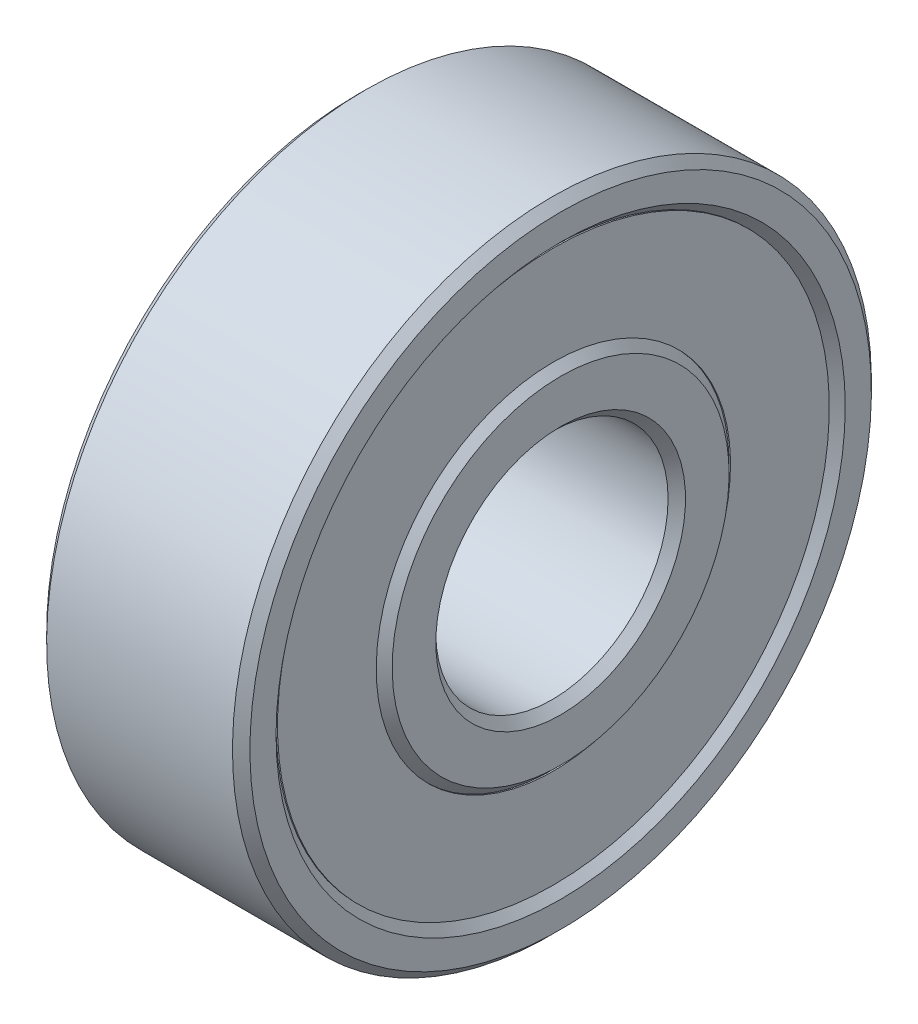
ISO-10303-21;
HEADER;
FILE_DESCRIPTION(('STEP AP214'),'2;1');
FILE_NAME('part.step','',(''),(''),'','','');
FILE_SCHEMA(('AUTOMOTIVE_DESIGN { 1 0 10303 214 1 1 1 1 }'));
ENDSEC;
DATA;
#1=APPLICATION_CONTEXT('core data for automotive mechanical design processes');
#2=APPLICATION_PROTOCOL_DEFINITION('international standard','automotive_design',2000,#1);
#3=PRODUCT_CONTEXT('',#1,'mechanical');
#4=PRODUCT('Part','Part','',(#3));
#5=PRODUCT_RELATED_PRODUCT_CATEGORY('part','',(#4));
#6=PRODUCT_DEFINITION_FORMATION('','',#4);
#7=PRODUCT_DEFINITION_CONTEXT('part definition',#1,'design');
#8=PRODUCT_DEFINITION('design','',#6,#7);
#9=PRODUCT_DEFINITION_SHAPE('','',#8);
#10=(LENGTH_UNIT() NAMED_UNIT(*) SI_UNIT(.MILLI.,.METRE.));
#11=(NAMED_UNIT(*) PLANE_ANGLE_UNIT() SI_UNIT($,.RADIAN.));
#12=(NAMED_UNIT(*) SI_UNIT($,.STERADIAN.) SOLID_ANGLE_UNIT());
#13=UNCERTAINTY_MEASURE_WITH_UNIT(LENGTH_MEASURE(1.E-05),#10,'distance_accuracy_value','');
#14=(GEOMETRIC_REPRESENTATION_CONTEXT(3) GLOBAL_UNCERTAINTY_ASSIGNED_CONTEXT((#13)) GLOBAL_UNIT_ASSIGNED_CONTEXT((#10,
#11,#12)) REPRESENTATION_CONTEXT('',''));
#15=CARTESIAN_POINT('',(0.,0.,0.));
#16=DIRECTION('',(0.,0.,1.));
#17=DIRECTION('',(1.,0.,0.));
#18=AXIS2_PLACEMENT_3D('',#15,#16,#17);
#19=CARTESIAN_POINT('',(0.25,0.,0.));
#20=DIRECTION('',(-1.,0.,0.));
#21=DIRECTION('',(0.,1.,0.));
#22=AXIS2_PLACEMENT_3D('',#19,#20,#21);
#23=CYLINDRICAL_SURFACE('',#22,6.1);
#24=CARTESIAN_POINT('',(6.75,0.,0.));
#25=DIRECTION('',(1.,0.,0.));
#26=DIRECTION('',(0.,1.,0.));
#27=AXIS2_PLACEMENT_3D('',#24,#25,#26);
#28=CIRCLE('',#27,6.1);
#29=CARTESIAN_POINT('',(6.75,6.10000000000005,0.));
#30=VERTEX_POINT('',#29);
#31=EDGE_CURVE('E10',#30,#30,#28,.T.);
#32=ORIENTED_EDGE('',*,*,#31,.T.);
#33=EDGE_LOOP('',(#32));
#34=FACE_BOUND('',#33,.T.);
#35=CARTESIAN_POINT('',(6.7,0.,0.));
#36=DIRECTION('',(1.,0.,0.));
#37=DIRECTION('',(0.,1.,0.));
#38=AXIS2_PLACEMENT_3D('',#35,#36,#37);
#39=CIRCLE('',#38,6.1);
#40=CARTESIAN_POINT('',(6.7,6.1,0.));
#41=VERTEX_POINT('',#40);
#42=EDGE_CURVE('E23',#41,#41,#39,.T.);
#43=ORIENTED_EDGE('',*,*,#42,.F.);
#44=EDGE_LOOP('',(#43));
#45=FACE_BOUND('',#44,.T.);
#46=ADVANCED_FACE('F15',(#34,#45),#23,.F.);
#47=CARTESIAN_POINT('',(6.75,0.,0.));
#48=DIRECTION('',(1.,0.,0.));
#49=DIRECTION('',(0.,1.,0.));
#50=AXIS2_PLACEMENT_3D('',#47,#48,#49);
#51=PLANE('',#50);
#52=ORIENTED_EDGE('',*,*,#31,.F.);
#53=EDGE_LOOP('',(#52));
#54=FACE_BOUND('',#53,.T.);
#55=CARTESIAN_POINT('',(6.75,0.,0.));
#56=DIRECTION('',(1.,0.,0.));
#57=DIRECTION('',(0.,1.,0.));
#58=AXIS2_PLACEMENT_3D('',#55,#56,#57);
#59=CIRCLE('',#58,9.5);
#60=CARTESIAN_POINT('',(6.75,9.5,0.));
#61=VERTEX_POINT('',#60);
#62=EDGE_CURVE('E33',#61,#61,#59,.T.);
#63=ORIENTED_EDGE('',*,*,#62,.T.);
#64=EDGE_LOOP('',(#63));
#65=FACE_BOUND('',#64,.T.);
#66=ADVANCED_FACE('F17',(#54,#65),#51,.T.);
#67=CARTESIAN_POINT('',(6.7,0.,0.));
#68=DIRECTION('',(-1.,0.,0.));
#69=DIRECTION('',(0.,1.,0.));
#70=AXIS2_PLACEMENT_3D('',#67,#68,#69);
#71=CONICAL_SURFACE('',#70,6.1,0.785398163397);
#72=CARTESIAN_POINT('',(7.,0.,0.));
#73=DIRECTION('',(1.,0.,0.));
#74=DIRECTION('',(0.,1.,0.));
#75=AXIS2_PLACEMENT_3D('',#72,#73,#74);
#76=CIRCLE('',#75,5.8);
#77=CARTESIAN_POINT('',(7.,5.8,0.));
#78=VERTEX_POINT('',#77);
#79=EDGE_CURVE('E40',#78,#78,#76,.T.);
#80=ORIENTED_EDGE('',*,*,#79,.F.);
#81=EDGE_LOOP('',(#80));
#82=FACE_BOUND('',#81,.T.);
#83=ORIENTED_EDGE('',*,*,#42,.T.);
#84=EDGE_LOOP('',(#83));
#85=FACE_BOUND('',#84,.T.);
#86=ADVANCED_FACE('F133',(#82,#85),#71,.T.);
#87=CARTESIAN_POINT('',(0.25,0.,0.));
#88=DIRECTION('',(-1.,0.,0.));
#89=DIRECTION('',(0.,1.,0.));
#90=AXIS2_PLACEMENT_3D('',#87,#88,#89);
#91=CYLINDRICAL_SURFACE('',#90,9.5);
#92=ORIENTED_EDGE('',*,*,#62,.F.);
#93=EDGE_LOOP('',(#92));
#94=FACE_BOUND('',#93,.T.);
#95=CARTESIAN_POINT('',(6.7,0.,0.));
#96=DIRECTION('',(1.,0.,0.));
#97=DIRECTION('',(0.,1.,0.));
#98=AXIS2_PLACEMENT_3D('',#95,#96,#97);
#99=CIRCLE('',#98,9.5);
#100=CARTESIAN_POINT('',(6.7,9.50000000000005,0.));
#101=VERTEX_POINT('',#100);
#102=EDGE_CURVE('E37',#101,#101,#99,.T.);
#103=ORIENTED_EDGE('',*,*,#102,.T.);
#104=EDGE_LOOP('',(#103));
#105=FACE_BOUND('',#104,.T.);
#106=ADVANCED_FACE('F180',(#94,#105),#91,.T.);
#107=CARTESIAN_POINT('',(7.,0.,0.));
#108=DIRECTION('',(1.,0.,0.));
#109=DIRECTION('',(0.,1.,0.));
#110=AXIS2_PLACEMENT_3D('',#107,#108,#109);
#111=PLANE('',#110);
#112=CARTESIAN_POINT('',(7.,0.,0.));
#113=DIRECTION('',(1.,0.,0.));
#114=DIRECTION('',(0.,1.,0.));
#115=AXIS2_PLACEMENT_3D('',#112,#113,#114);
#116=CIRCLE('',#115,4.3);
#117=CARTESIAN_POINT('',(7.,4.30000000000003,0.));
#118=VERTEX_POINT('',#117);
#119=EDGE_CURVE('E42',#118,#118,#116,.T.);
#120=ORIENTED_EDGE('',*,*,#119,.F.);
#121=EDGE_LOOP('',(#120));
#122=FACE_BOUND('',#121,.T.);
#123=ORIENTED_EDGE('',*,*,#79,.T.);
#124=EDGE_LOOP('',(#123));
#125=FACE_BOUND('',#124,.T.);
#126=ADVANCED_FACE('F154',(#122,#125),#111,.T.);
#127=CARTESIAN_POINT('',(6.7,0.,0.));
#128=DIRECTION('',(1.,0.,0.));
#129=DIRECTION('',(0.,1.,0.));
#130=AXIS2_PLACEMENT_3D('',#127,#128,#129);
#131=CONICAL_SURFACE('',#130,9.5,0.785398163397);
#132=CARTESIAN_POINT('',(7.,0.,0.));
#133=DIRECTION('',(1.,0.,0.));
#134=DIRECTION('',(0.,1.,0.));
#135=AXIS2_PLACEMENT_3D('',#132,#133,#134);
#136=CIRCLE('',#135,9.8);
#137=CARTESIAN_POINT('',(7.,9.80000000000005,0.));
#138=VERTEX_POINT('',#137);
#139=EDGE_CURVE('E48',#138,#138,#136,.T.);
#140=ORIENTED_EDGE('',*,*,#139,.T.);
#141=EDGE_LOOP('',(#140));
#142=FACE_BOUND('',#141,.T.);
#143=ORIENTED_EDGE('',*,*,#102,.F.);
#144=EDGE_LOOP('',(#143));
#145=FACE_BOUND('',#144,.T.);
#146=ADVANCED_FACE('F136',(#142,#145),#131,.F.);
#147=CARTESIAN_POINT('',(6.7,0.,0.));
#148=DIRECTION('',(1.,0.,0.));
#149=DIRECTION('',(0.,1.,0.));
#150=AXIS2_PLACEMENT_3D('',#147,#148,#149);
#151=CONICAL_SURFACE('',#150,4.,0.785398163397);
#152=ORIENTED_EDGE('',*,*,#119,.T.);
#153=EDGE_LOOP('',(#152));
#154=FACE_BOUND('',#153,.T.);
#155=CARTESIAN_POINT('',(6.7,0.,0.));
#156=DIRECTION('',(1.,0.,0.));
#157=DIRECTION('',(0.,1.,0.));
#158=AXIS2_PLACEMENT_3D('',#155,#156,#157);
#159=CIRCLE('',#158,4.);
#160=CARTESIAN_POINT('',(6.7,4.00000000000003,0.));
#161=VERTEX_POINT('',#160);
#162=EDGE_CURVE('E55',#161,#161,#159,.T.);
#163=ORIENTED_EDGE('',*,*,#162,.F.);
#164=EDGE_LOOP('',(#163));
#165=FACE_BOUND('',#164,.T.);
#166=ADVANCED_FACE('F145',(#154,#165),#151,.F.);
#167=CARTESIAN_POINT('',(7.,0.,0.));
#168=DIRECTION('',(1.,0.,0.));
#169=DIRECTION('',(0.,1.,0.));
#170=AXIS2_PLACEMENT_3D('',#167,#168,#169);
#171=PLANE('',#170);
#172=ORIENTED_EDGE('',*,*,#139,.F.);
#173=EDGE_LOOP('',(#172));
#174=FACE_BOUND('',#173,.T.);
#175=CARTESIAN_POINT('',(7.,0.,0.));
#176=DIRECTION('',(1.,0.,0.));
#177=DIRECTION('',(0.,1.,0.));
#178=AXIS2_PLACEMENT_3D('',#175,#176,#177);
#179=CIRCLE('',#178,10.7);
#180=CARTESIAN_POINT('',(7.,10.7,0.));
#181=VERTEX_POINT('',#180);
#182=EDGE_CURVE('E57',#181,#181,#179,.T.);
#183=ORIENTED_EDGE('',*,*,#182,.T.);
#184=EDGE_LOOP('',(#183));
#185=FACE_BOUND('',#184,.T.);
#186=ADVANCED_FACE('F148',(#174,#185),#171,.T.);
#187=CARTESIAN_POINT('',(0.,0.,0.));
#188=DIRECTION('',(-1.,0.,0.));
#189=DIRECTION('',(0.,1.,0.));
#190=AXIS2_PLACEMENT_3D('',#187,#188,#189);
#191=CYLINDRICAL_SURFACE('',#190,4.);
#192=ORIENTED_EDGE('',*,*,#162,.T.);
#193=EDGE_LOOP('',(#192));
#194=FACE_BOUND('',#193,.T.);
#195=CARTESIAN_POINT('',(0.3,0.,0.));
#196=DIRECTION('',(1.,0.,0.));
#197=DIRECTION('',(0.,1.,0.));
#198=AXIS2_PLACEMENT_3D('',#195,#196,#197);
#199=CIRCLE('',#198,4.);
#200=CARTESIAN_POINT('',(0.3,4.00000000000003,0.));
#201=VERTEX_POINT('',#200);
#202=EDGE_CURVE('E60',#201,#201,#199,.T.);
#203=ORIENTED_EDGE('',*,*,#202,.F.);
#204=EDGE_LOOP('',(#203));
#205=FACE_BOUND('',#204,.T.);
#206=ADVANCED_FACE('F155',(#194,#205),#191,.F.);
#207=CARTESIAN_POINT('',(6.7,0.,0.));
#208=DIRECTION('',(-1.,0.,0.));
#209=DIRECTION('',(0.,1.,0.));
#210=AXIS2_PLACEMENT_3D('',#207,#208,#209);
#211=CONICAL_SURFACE('',#210,11.,0.785398163397);
#212=ORIENTED_EDGE('',*,*,#182,.F.);
#213=EDGE_LOOP('',(#212));
#214=FACE_BOUND('',#213,.T.);
#215=CARTESIAN_POINT('',(6.7,0.,0.));
#216=DIRECTION('',(1.,0.,0.));
#217=DIRECTION('',(0.,1.,0.));
#218=AXIS2_PLACEMENT_3D('',#215,#216,#217);
#219=CIRCLE('',#218,11.);
#220=CARTESIAN_POINT('',(6.7,11.,0.));
#221=VERTEX_POINT('',#220);
#222=EDGE_CURVE('E61',#221,#221,#219,.T.);
#223=ORIENTED_EDGE('',*,*,#222,.T.);
#224=EDGE_LOOP('',(#223));
#225=FACE_BOUND('',#224,.T.);
#226=ADVANCED_FACE('F162',(#214,#225),#211,.T.);
#227=CARTESIAN_POINT('',(0.3,0.,0.));
#228=DIRECTION('',(-1.,0.,0.));
#229=DIRECTION('',(0.,1.,0.));
#230=AXIS2_PLACEMENT_3D('',#227,#228,#229);
#231=CONICAL_SURFACE('',#230,4.,0.785398163397);
#232=CARTESIAN_POINT('',(0.,0.,0.));
#233=DIRECTION('',(1.,0.,0.));
#234=DIRECTION('',(0.,1.,0.));
#235=AXIS2_PLACEMENT_3D('',#232,#233,#234);
#236=CIRCLE('',#235,4.3);
#237=CARTESIAN_POINT('',(0.,4.30000000000003,0.));
#238=VERTEX_POINT('',#237);
#239=EDGE_CURVE('E65',#238,#238,#236,.T.);
#240=ORIENTED_EDGE('',*,*,#239,.F.);
#241=EDGE_LOOP('',(#240));
#242=FACE_BOUND('',#241,.T.);
#243=ORIENTED_EDGE('',*,*,#202,.T.);
#244=EDGE_LOOP('',(#243));
#245=FACE_BOUND('',#244,.T.);
#246=ADVANCED_FACE('F124',(#242,#245),#231,.F.);
#247=CARTESIAN_POINT('',(0.,0.,0.));
#248=DIRECTION('',(-1.,0.,0.));
#249=DIRECTION('',(0.,1.,0.));
#250=AXIS2_PLACEMENT_3D('',#247,#248,#249);
#251=CYLINDRICAL_SURFACE('',#250,11.);
#252=ORIENTED_EDGE('',*,*,#222,.F.);
#253=EDGE_LOOP('',(#252));
#254=FACE_BOUND('',#253,.T.);
#255=CARTESIAN_POINT('',(0.3,0.,0.));
#256=DIRECTION('',(1.,0.,0.));
#257=DIRECTION('',(0.,1.,0.));
#258=AXIS2_PLACEMENT_3D('',#255,#256,#257);
#259=CIRCLE('',#258,11.);
#260=CARTESIAN_POINT('',(0.3,11.,0.));
#261=VERTEX_POINT('',#260);
#262=EDGE_CURVE('E67',#261,#261,#259,.T.);
#263=ORIENTED_EDGE('',*,*,#262,.T.);
#264=EDGE_LOOP('',(#263));
#265=FACE_BOUND('',#264,.T.);
#266=ADVANCED_FACE('F113',(#254,#265),#251,.T.);
#267=CARTESIAN_POINT('',(0.,0.,0.));
#268=DIRECTION('',(1.,0.,0.));
#269=DIRECTION('',(0.,1.,0.));
#270=AXIS2_PLACEMENT_3D('',#267,#268,#269);
#271=PLANE('',#270);
#272=ORIENTED_EDGE('',*,*,#239,.T.);
#273=EDGE_LOOP('',(#272));
#274=FACE_BOUND('',#273,.T.);
#275=CARTESIAN_POINT('',(0.,0.,0.));
#276=DIRECTION('',(1.,0.,0.));
#277=DIRECTION('',(0.,1.,0.));
#278=AXIS2_PLACEMENT_3D('',#275,#276,#277);
#279=CIRCLE('',#278,5.8);
#280=CARTESIAN_POINT('',(0.,5.8,0.));
#281=VERTEX_POINT('',#280);
#282=EDGE_CURVE('E73',#281,#281,#279,.T.);
#283=ORIENTED_EDGE('',*,*,#282,.F.);
#284=EDGE_LOOP('',(#283));
#285=FACE_BOUND('',#284,.T.);
#286=ADVANCED_FACE('F115',(#274,#285),#271,.F.);
#287=CARTESIAN_POINT('',(0.3,0.,0.));
#288=DIRECTION('',(1.,0.,0.));
#289=DIRECTION('',(0.,1.,0.));
#290=AXIS2_PLACEMENT_3D('',#287,#288,#289);
#291=CONICAL_SURFACE('',#290,11.,0.785398163397);
#292=CARTESIAN_POINT('',(0.,0.,0.));
#293=DIRECTION('',(1.,0.,0.));
#294=DIRECTION('',(0.,1.,0.));
#295=AXIS2_PLACEMENT_3D('',#292,#293,#294);
#296=CIRCLE('',#295,10.7);
#297=CARTESIAN_POINT('',(0.,10.7,0.));
#298=VERTEX_POINT('',#297);
#299=EDGE_CURVE('E82',#298,#298,#296,.T.);
#300=ORIENTED_EDGE('',*,*,#299,.T.);
#301=EDGE_LOOP('',(#300));
#302=FACE_BOUND('',#301,.T.);
#303=ORIENTED_EDGE('',*,*,#262,.F.);
#304=EDGE_LOOP('',(#303));
#305=FACE_BOUND('',#304,.T.);
#306=ADVANCED_FACE('F111',(#302,#305),#291,.T.);
#307=CARTESIAN_POINT('',(0.3,0.,0.));
#308=DIRECTION('',(1.,0.,0.));
#309=DIRECTION('',(0.,1.,0.));
#310=AXIS2_PLACEMENT_3D('',#307,#308,#309);
#311=CONICAL_SURFACE('',#310,6.1,0.785398163397);
#312=ORIENTED_EDGE('',*,*,#282,.T.);
#313=EDGE_LOOP('',(#312));
#314=FACE_BOUND('',#313,.T.);
#315=CARTESIAN_POINT('',(0.3,0.,0.));
#316=DIRECTION('',(1.,0.,0.));
#317=DIRECTION('',(0.,1.,0.));
#318=AXIS2_PLACEMENT_3D('',#315,#316,#317);
#319=CIRCLE('',#318,6.1);
#320=CARTESIAN_POINT('',(0.3,6.1,0.));
#321=VERTEX_POINT('',#320);
#322=EDGE_CURVE('E80',#321,#321,#319,.T.);
#323=ORIENTED_EDGE('',*,*,#322,.F.);
#324=EDGE_LOOP('',(#323));
#325=FACE_BOUND('',#324,.T.);
#326=ADVANCED_FACE('F108',(#314,#325),#311,.T.);
#327=CARTESIAN_POINT('',(0.,0.,0.));
#328=DIRECTION('',(1.,0.,0.));
#329=DIRECTION('',(0.,1.,0.));
#330=AXIS2_PLACEMENT_3D('',#327,#328,#329);
#331=PLANE('',#330);
#332=CARTESIAN_POINT('',(0.,0.,0.));
#333=DIRECTION('',(1.,0.,0.));
#334=DIRECTION('',(0.,1.,0.));
#335=AXIS2_PLACEMENT_3D('',#332,#333,#334);
#336=CIRCLE('',#335,9.8);
#337=CARTESIAN_POINT('',(0.,9.80000000000005,0.));
#338=VERTEX_POINT('',#337);
#339=EDGE_CURVE('E85',#338,#338,#336,.T.);
#340=ORIENTED_EDGE('',*,*,#339,.T.);
#341=EDGE_LOOP('',(#340));
#342=FACE_BOUND('',#341,.T.);
#343=ORIENTED_EDGE('',*,*,#299,.F.);
#344=EDGE_LOOP('',(#343));
#345=FACE_BOUND('',#344,.T.);
#346=ADVANCED_FACE('F141',(#342,#345),#331,.F.);
#347=CARTESIAN_POINT('',(0.25,0.,0.));
#348=DIRECTION('',(-1.,0.,0.));
#349=DIRECTION('',(0.,1.,0.));
#350=AXIS2_PLACEMENT_3D('',#347,#348,#349);
#351=CYLINDRICAL_SURFACE('',#350,6.1);
#352=ORIENTED_EDGE('',*,*,#322,.T.);
#353=EDGE_LOOP('',(#352));
#354=FACE_BOUND('',#353,.T.);
#355=CARTESIAN_POINT('',(0.25,0.,0.));
#356=DIRECTION('',(1.,0.,0.));
#357=DIRECTION('',(0.,1.,0.));
#358=AXIS2_PLACEMENT_3D('',#355,#356,#357);
#359=CIRCLE('',#358,6.1);
#360=CARTESIAN_POINT('',(0.25,6.10000000000005,0.));
#361=VERTEX_POINT('',#360);
#362=EDGE_CURVE('E90',#361,#361,#359,.T.);
#363=ORIENTED_EDGE('',*,*,#362,.F.);
#364=EDGE_LOOP('',(#363));
#365=FACE_BOUND('',#364,.T.);
#366=ADVANCED_FACE('F265',(#354,#365),#351,.F.);
#367=CARTESIAN_POINT('',(0.3,0.,0.));
#368=DIRECTION('',(-1.,0.,0.));
#369=DIRECTION('',(0.,1.,0.));
#370=AXIS2_PLACEMENT_3D('',#367,#368,#369);
#371=CONICAL_SURFACE('',#370,9.5,0.785398163397);
#372=ORIENTED_EDGE('',*,*,#339,.F.);
#373=EDGE_LOOP('',(#372));
#374=FACE_BOUND('',#373,.T.);
#375=CARTESIAN_POINT('',(0.3,0.,0.));
#376=DIRECTION('',(1.,0.,0.));
#377=DIRECTION('',(0.,1.,0.));
#378=AXIS2_PLACEMENT_3D('',#375,#376,#377);
#379=CIRCLE('',#378,9.5);
#380=CARTESIAN_POINT('',(0.3,9.50000000000005,0.));
#381=VERTEX_POINT('',#380);
#382=EDGE_CURVE('E89',#381,#381,#379,.T.);
#383=ORIENTED_EDGE('',*,*,#382,.T.);
#384=EDGE_LOOP('',(#383));
#385=FACE_BOUND('',#384,.T.);
#386=ADVANCED_FACE('F271',(#374,#385),#371,.F.);
#387=CARTESIAN_POINT('',(0.25,0.,0.));
#388=DIRECTION('',(1.,0.,0.));
#389=DIRECTION('',(0.,1.,0.));
#390=AXIS2_PLACEMENT_3D('',#387,#388,#389);
#391=PLANE('',#390);
#392=ORIENTED_EDGE('',*,*,#362,.T.);
#393=EDGE_LOOP('',(#392));
#394=FACE_BOUND('',#393,.T.);
#395=CARTESIAN_POINT('',(0.25,0.,0.));
#396=DIRECTION('',(1.,0.,0.));
#397=DIRECTION('',(0.,1.,0.));
#398=AXIS2_PLACEMENT_3D('',#395,#396,#397);
#399=CIRCLE('',#398,9.5);
#400=CARTESIAN_POINT('',(0.25,9.5,0.));
#401=VERTEX_POINT('',#400);
#402=EDGE_CURVE('E94',#401,#401,#399,.T.);
#403=ORIENTED_EDGE('',*,*,#402,.F.);
#404=EDGE_LOOP('',(#403));
#405=FACE_BOUND('',#404,.T.);
#406=ADVANCED_FACE('F281',(#394,#405),#391,.F.);
#407=CARTESIAN_POINT('',(0.25,0.,0.));
#408=DIRECTION('',(-1.,0.,0.));
#409=DIRECTION('',(0.,1.,0.));
#410=AXIS2_PLACEMENT_3D('',#407,#408,#409);
#411=CYLINDRICAL_SURFACE('',#410,9.5);
#412=ORIENTED_EDGE('',*,*,#382,.F.);
#413=EDGE_LOOP('',(#412));
#414=FACE_BOUND('',#413,.T.);
#415=ORIENTED_EDGE('',*,*,#402,.T.);
#416=EDGE_LOOP('',(#415));
#417=FACE_BOUND('',#416,.T.);
#418=ADVANCED_FACE('F295',(#414,#417),#411,.T.);
#419=CLOSED_SHELL('',(#46,#66,#86,#106,#126,#146,#166,#186,#206,#226,#246,#266,#286,#306,#326,
#346,#366,#386,#406,#418));
#420=MANIFOLD_SOLID_BREP('B1',#419);
#421=ADVANCED_BREP_SHAPE_REPRESENTATION('',(#18,#420),#14);
#422=SHAPE_DEFINITION_REPRESENTATION(#9,#421);
ENDSEC;
END-ISO-10303-21;
